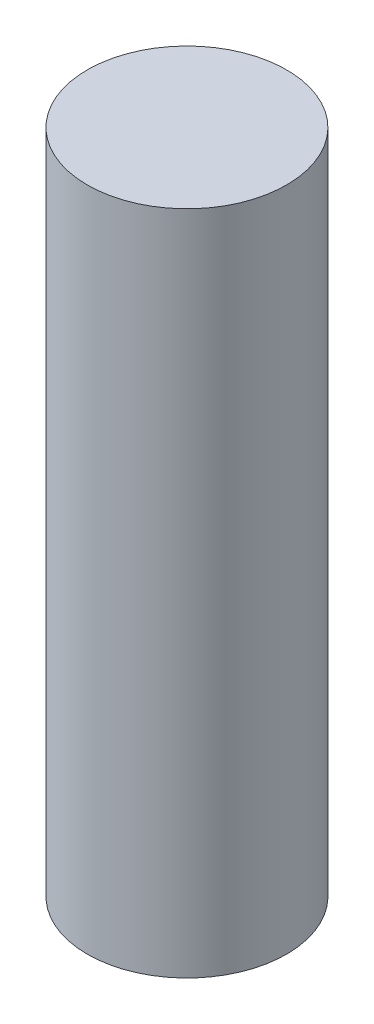
ISO-10303-21;
HEADER;
FILE_DESCRIPTION(('STEP AP214'),'2;1');
FILE_NAME('part.step','',(''),(''),'','','');
FILE_SCHEMA(('AUTOMOTIVE_DESIGN { 1 0 10303 214 1 1 1 1 }'));
ENDSEC;
DATA;
#1=APPLICATION_CONTEXT('core data for automotive mechanical design processes');
#2=APPLICATION_PROTOCOL_DEFINITION('international standard','automotive_design',2000,#1);
#3=PRODUCT_CONTEXT('',#1,'mechanical');
#4=PRODUCT('Part','Part','',(#3));
#5=PRODUCT_RELATED_PRODUCT_CATEGORY('part','',(#4));
#6=PRODUCT_DEFINITION_FORMATION('','',#4);
#7=PRODUCT_DEFINITION_CONTEXT('part definition',#1,'design');
#8=PRODUCT_DEFINITION('design','',#6,#7);
#9=PRODUCT_DEFINITION_SHAPE('','',#8);
#10=(LENGTH_UNIT() NAMED_UNIT(*) SI_UNIT(.MILLI.,.METRE.));
#11=(NAMED_UNIT(*) PLANE_ANGLE_UNIT() SI_UNIT($,.RADIAN.));
#12=(NAMED_UNIT(*) SI_UNIT($,.STERADIAN.) SOLID_ANGLE_UNIT());
#13=UNCERTAINTY_MEASURE_WITH_UNIT(LENGTH_MEASURE(1.E-05),#10,'distance_accuracy_value','');
#14=(GEOMETRIC_REPRESENTATION_CONTEXT(3) GLOBAL_UNCERTAINTY_ASSIGNED_CONTEXT((#13)) GLOBAL_UNIT_ASSIGNED_CONTEXT((#10,
#11,#12)) REPRESENTATION_CONTEXT('',''));
#15=CARTESIAN_POINT('',(0.,0.,0.));
#16=DIRECTION('',(0.,0.,1.));
#17=DIRECTION('',(1.,0.,0.));
#18=AXIS2_PLACEMENT_3D('',#15,#16,#17);
#19=CARTESIAN_POINT('',(0.,70.73,0.));
#20=DIRECTION('',(0.,-1.,0.));
#21=DIRECTION('',(0.,0.,-1.));
#22=AXIS2_PLACEMENT_3D('',#19,#20,#21);
#23=CYLINDRICAL_SURFACE('',#22,10.585);
#24=CARTESIAN_POINT('',(0.,70.73,0.));
#25=DIRECTION('',(0.,1.,0.));
#26=DIRECTION('',(0.,0.,1.));
#27=AXIS2_PLACEMENT_3D('',#24,#25,#26);
#28=CIRCLE('',#27,10.585);
#29=CARTESIAN_POINT('',(0.,70.73,10.585));
#30=VERTEX_POINT('',#29);
#31=EDGE_CURVE('E10',#30,#30,#28,.T.);
#32=ORIENTED_EDGE('',*,*,#31,.F.);
#33=EDGE_LOOP('',(#32));
#34=FACE_BOUND('',#33,.T.);
#35=CARTESIAN_POINT('',(0.,0.,0.));
#36=DIRECTION('',(0.,1.,0.));
#37=DIRECTION('',(0.,0.,1.));
#38=AXIS2_PLACEMENT_3D('',#35,#36,#37);
#39=CIRCLE('',#38,10.585);
#40=CARTESIAN_POINT('',(0.,0.,10.585));
#41=VERTEX_POINT('',#40);
#42=EDGE_CURVE('E40',#41,#41,#39,.T.);
#43=ORIENTED_EDGE('',*,*,#42,.T.);
#44=EDGE_LOOP('',(#43));
#45=FACE_BOUND('',#44,.T.);
#46=ADVANCED_FACE('F37',(#34,#45),#23,.T.);
#47=CARTESIAN_POINT('',(0.,70.73,0.));
#48=DIRECTION('',(0.,1.,0.));
#49=DIRECTION('',(0.,0.,1.));
#50=AXIS2_PLACEMENT_3D('',#47,#48,#49);
#51=PLANE('',#50);
#52=ORIENTED_EDGE('',*,*,#31,.T.);
#53=EDGE_LOOP('',(#52));
#54=FACE_BOUND('',#53,.T.);
#55=ADVANCED_FACE('F54',(#54),#51,.T.);
#56=CARTESIAN_POINT('',(0.,0.,0.));
#57=DIRECTION('',(0.,1.,0.));
#58=DIRECTION('',(0.,0.,1.));
#59=AXIS2_PLACEMENT_3D('',#56,#57,#58);
#60=PLANE('',#59);
#61=ORIENTED_EDGE('',*,*,#42,.F.);
#62=EDGE_LOOP('',(#61));
#63=FACE_BOUND('',#62,.T.);
#64=ADVANCED_FACE('F52',(#63),#60,.F.);
#65=CLOSED_SHELL('',(#46,#55,#64));
#66=MANIFOLD_SOLID_BREP('B2',#65);
#67=ADVANCED_BREP_SHAPE_REPRESENTATION('',(#18,#66),#14);
#68=SHAPE_DEFINITION_REPRESENTATION(#9,#67);
ENDSEC;
END-ISO-10303-21;
